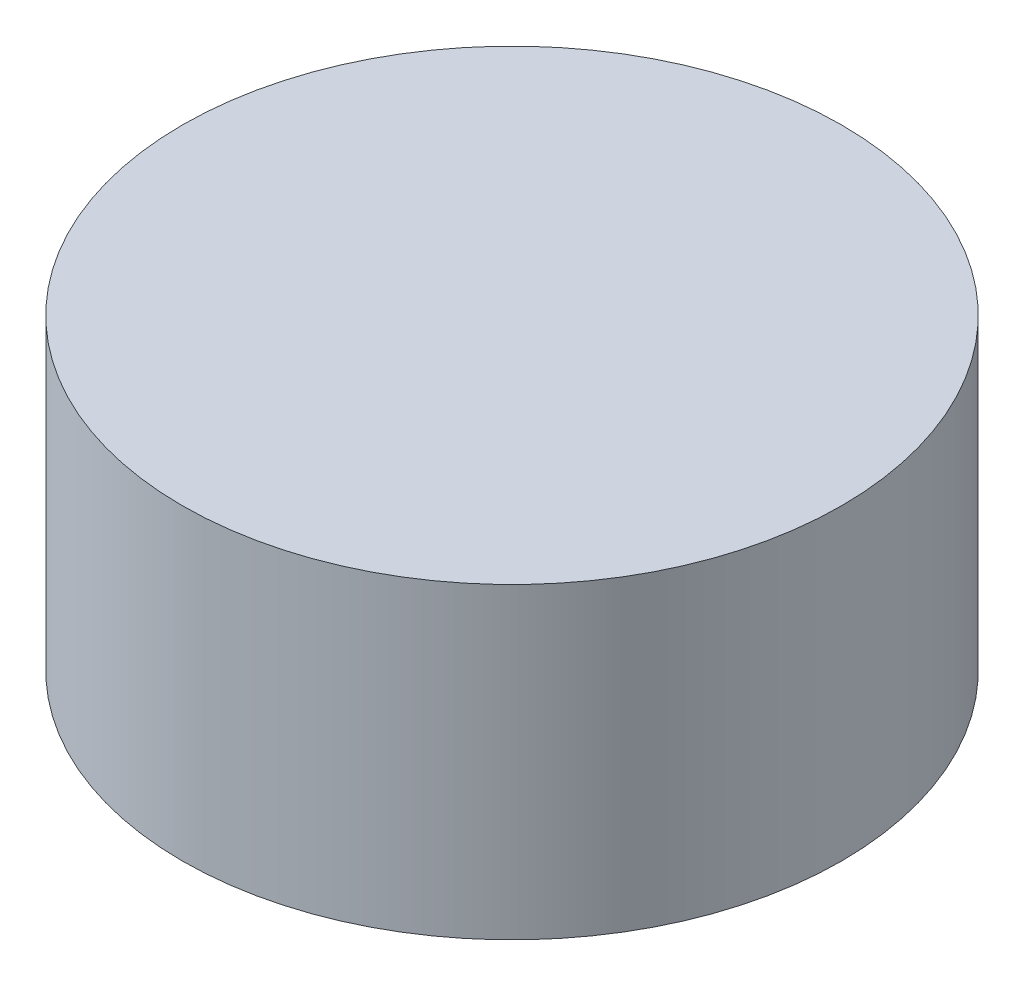
ISO-10303-21;
HEADER;
FILE_DESCRIPTION(('STEP AP214'),'2;1');
FILE_NAME('part.step','',(''),(''),'','','');
FILE_SCHEMA(('AUTOMOTIVE_DESIGN { 1 0 10303 214 1 1 1 1 }'));
ENDSEC;
DATA;
#1=APPLICATION_CONTEXT('core data for automotive mechanical design processes');
#2=APPLICATION_PROTOCOL_DEFINITION('international standard','automotive_design',2000,#1);
#3=PRODUCT_CONTEXT('',#1,'mechanical');
#4=PRODUCT('Part','Part','',(#3));
#5=PRODUCT_RELATED_PRODUCT_CATEGORY('part','',(#4));
#6=PRODUCT_DEFINITION_FORMATION('','',#4);
#7=PRODUCT_DEFINITION_CONTEXT('part definition',#1,'design');
#8=PRODUCT_DEFINITION('design','',#6,#7);
#9=PRODUCT_DEFINITION_SHAPE('','',#8);
#10=(LENGTH_UNIT() NAMED_UNIT(*) SI_UNIT(.MILLI.,.METRE.));
#11=(NAMED_UNIT(*) PLANE_ANGLE_UNIT() SI_UNIT($,.RADIAN.));
#12=(NAMED_UNIT(*) SI_UNIT($,.STERADIAN.) SOLID_ANGLE_UNIT());
#13=UNCERTAINTY_MEASURE_WITH_UNIT(LENGTH_MEASURE(1.E-05),#10,'distance_accuracy_value','');
#14=(GEOMETRIC_REPRESENTATION_CONTEXT(3) GLOBAL_UNCERTAINTY_ASSIGNED_CONTEXT((#13)) GLOBAL_UNIT_ASSIGNED_CONTEXT((#10,
#11,#12)) REPRESENTATION_CONTEXT('',''));
#15=CARTESIAN_POINT('',(0.,0.,0.));
#16=DIRECTION('',(0.,0.,1.));
#17=DIRECTION('',(1.,0.,0.));
#18=AXIS2_PLACEMENT_3D('',#15,#16,#17);
#19=CARTESIAN_POINT('',(0.,70.,0.));
#20=DIRECTION('',(0.,-1.,0.));
#21=DIRECTION('',(0.,0.,-1.));
#22=AXIS2_PLACEMENT_3D('',#19,#20,#21);
#23=CYLINDRICAL_SURFACE('',#22,75.);
#24=CARTESIAN_POINT('',(0.,70.,0.));
#25=DIRECTION('',(0.,1.,0.));
#26=DIRECTION('',(0.,0.,1.));
#27=AXIS2_PLACEMENT_3D('',#24,#25,#26);
#28=CIRCLE('',#27,75.);
#29=CARTESIAN_POINT('',(0.,70.,75.));
#30=VERTEX_POINT('',#29);
#31=EDGE_CURVE('E10',#30,#30,#28,.T.);
#32=ORIENTED_EDGE('',*,*,#31,.F.);
#33=EDGE_LOOP('',(#32));
#34=FACE_BOUND('',#33,.T.);
#35=CARTESIAN_POINT('',(0.,0.,0.));
#36=DIRECTION('',(0.,1.,0.));
#37=DIRECTION('',(0.,0.,1.));
#38=AXIS2_PLACEMENT_3D('',#35,#36,#37);
#39=CIRCLE('',#38,75.);
#40=CARTESIAN_POINT('',(0.,0.,75.));
#41=VERTEX_POINT('',#40);
#42=EDGE_CURVE('E35',#41,#41,#39,.T.);
#43=ORIENTED_EDGE('',*,*,#42,.T.);
#44=EDGE_LOOP('',(#43));
#45=FACE_BOUND('',#44,.T.);
#46=ADVANCED_FACE('F32',(#34,#45),#23,.T.);
#47=CARTESIAN_POINT('',(0.,70.,0.));
#48=DIRECTION('',(0.,1.,0.));
#49=DIRECTION('',(0.,0.,1.));
#50=AXIS2_PLACEMENT_3D('',#47,#48,#49);
#51=PLANE('',#50);
#52=ORIENTED_EDGE('',*,*,#31,.T.);
#53=EDGE_LOOP('',(#52));
#54=FACE_BOUND('',#53,.T.);
#55=ADVANCED_FACE('F47',(#54),#51,.T.);
#56=CARTESIAN_POINT('',(0.,0.,0.));
#57=DIRECTION('',(0.,1.,0.));
#58=DIRECTION('',(0.,0.,1.));
#59=AXIS2_PLACEMENT_3D('',#56,#57,#58);
#60=PLANE('',#59);
#61=ORIENTED_EDGE('',*,*,#42,.F.);
#62=EDGE_LOOP('',(#61));
#63=FACE_BOUND('',#62,.T.);
#64=ADVANCED_FACE('F45',(#63),#60,.F.);
#65=CLOSED_SHELL('',(#46,#55,#64));
#66=MANIFOLD_SOLID_BREP('B2',#65);
#67=ADVANCED_BREP_SHAPE_REPRESENTATION('',(#18,#66),#14);
#68=SHAPE_DEFINITION_REPRESENTATION(#9,#67);
ENDSEC;
END-ISO-10303-21;
